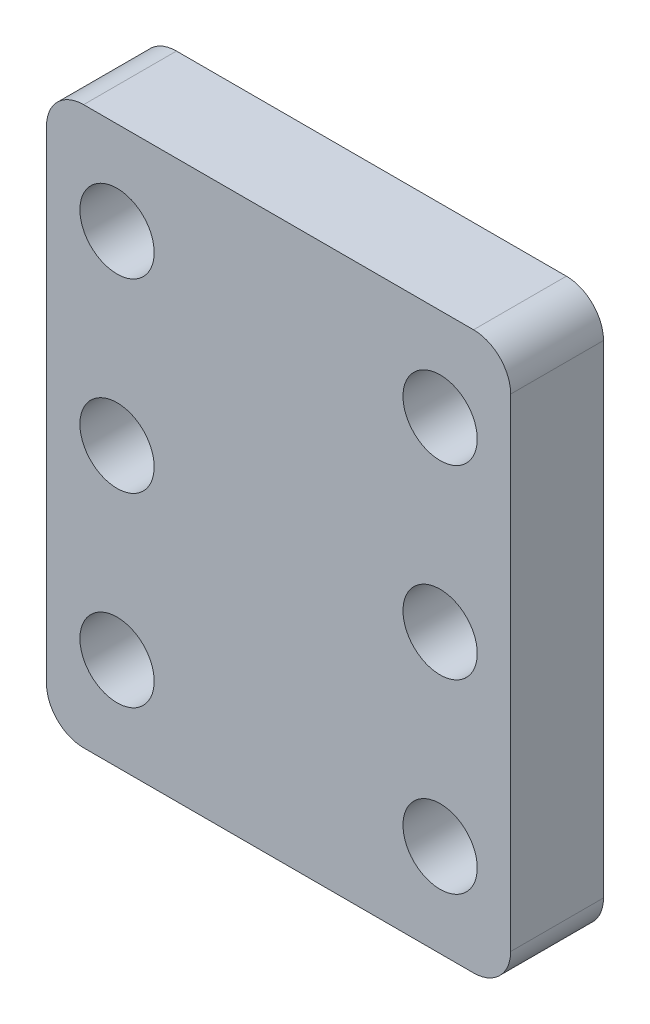
ISO-10303-21;
HEADER;
FILE_DESCRIPTION(('STEP AP214'),'2;1');
FILE_NAME('part.step','',(''),(''),'','','');
FILE_SCHEMA(('AUTOMOTIVE_DESIGN { 1 0 10303 214 1 1 1 1 }'));
ENDSEC;
DATA;
#1=APPLICATION_CONTEXT('core data for automotive mechanical design processes');
#2=APPLICATION_PROTOCOL_DEFINITION('international standard','automotive_design',2000,#1);
#3=PRODUCT_CONTEXT('',#1,'mechanical');
#4=PRODUCT('Part','Part','',(#3));
#5=PRODUCT_RELATED_PRODUCT_CATEGORY('part','',(#4));
#6=PRODUCT_DEFINITION_FORMATION('','',#4);
#7=PRODUCT_DEFINITION_CONTEXT('part definition',#1,'design');
#8=PRODUCT_DEFINITION('design','',#6,#7);
#9=PRODUCT_DEFINITION_SHAPE('','',#8);
#10=(LENGTH_UNIT() NAMED_UNIT(*) SI_UNIT(.MILLI.,.METRE.));
#11=(NAMED_UNIT(*) PLANE_ANGLE_UNIT() SI_UNIT($,.RADIAN.));
#12=(NAMED_UNIT(*) SI_UNIT($,.STERADIAN.) SOLID_ANGLE_UNIT());
#13=UNCERTAINTY_MEASURE_WITH_UNIT(LENGTH_MEASURE(1.E-05),#10,'distance_accuracy_value','');
#14=(GEOMETRIC_REPRESENTATION_CONTEXT(3) GLOBAL_UNCERTAINTY_ASSIGNED_CONTEXT((#13)) GLOBAL_UNIT_ASSIGNED_CONTEXT((#10,
#11,#12)) REPRESENTATION_CONTEXT('',''));
#15=CARTESIAN_POINT('',(0.,0.,0.));
#16=DIRECTION('',(0.,0.,1.));
#17=DIRECTION('',(1.,0.,0.));
#18=AXIS2_PLACEMENT_3D('',#15,#16,#17);
#19=CARTESIAN_POINT('',(-9.73666666666669,36.7241666666667,6.35));
#20=DIRECTION('',(0.,-1.,0.));
#21=DIRECTION('',(1.,0.,0.));
#22=AXIS2_PLACEMENT_3D('',#19,#20,#21);
#23=PLANE('',#22);
#24=DIRECTION('',(-1.,0.,0.));
#25=VECTOR('',#24,1.);
#26=CARTESIAN_POINT('',(-9.73666666666669,36.7241666666667,6.35));
#27=LINE('',#26,#25);
#28=CARTESIAN_POINT('',(-12.2766666666667,36.7241666666667,6.35));
#29=VERTEX_POINT('',#28);
#30=CARTESIAN_POINT('',(-38.9466666666667,36.7241666666667,6.35));
#31=VERTEX_POINT('',#30);
#32=EDGE_CURVE('E130',#29,#31,#27,.T.);
#33=ORIENTED_EDGE('',*,*,#32,.F.);
#34=DIRECTION('',(0.,0.,-1.));
#35=VECTOR('',#34,1.);
#36=CARTESIAN_POINT('',(-12.2766666666667,36.7241666666667,6.35));
#37=LINE('',#36,#35);
#38=CARTESIAN_POINT('',(-12.2766666666667,36.7241666666667,0.));
#39=VERTEX_POINT('',#38);
#40=EDGE_CURVE('E114',#29,#39,#37,.T.);
#41=ORIENTED_EDGE('',*,*,#40,.T.);
#42=DIRECTION('',(-1.,0.,0.));
#43=VECTOR('',#42,1.);
#44=CARTESIAN_POINT('',(-9.73666666666669,36.7241666666667,0.));
#45=LINE('',#44,#43);
#46=CARTESIAN_POINT('',(-38.9466666666667,36.7241666666667,0.));
#47=VERTEX_POINT('',#46);
#48=EDGE_CURVE('E127',#39,#47,#45,.T.);
#49=ORIENTED_EDGE('',*,*,#48,.T.);
#50=DIRECTION('',(0.,0.,-1.));
#51=VECTOR('',#50,1.);
#52=CARTESIAN_POINT('',(-38.9466666666667,36.7241666666667,6.35));
#53=LINE('',#52,#51);
#54=EDGE_CURVE('E133',#47,#31,#53,.F.);
#55=ORIENTED_EDGE('',*,*,#54,.T.);
#56=EDGE_LOOP('',(#33,#41,#49,#55));
#57=FACE_BOUND('',#56,.T.);
#58=ADVANCED_FACE('F43',(#57),#23,.F.);
#59=CARTESIAN_POINT('',(-41.4866666666667,36.7241666666667,6.35));
#60=DIRECTION('',(1.,0.,0.));
#61=DIRECTION('',(0.,0.,-1.));
#62=AXIS2_PLACEMENT_3D('',#59,#60,#61);
#63=PLANE('',#62);
#64=DIRECTION('',(0.,-1.,0.));
#65=VECTOR('',#64,1.);
#66=CARTESIAN_POINT('',(-41.4866666666667,36.7241666666667,0.));
#67=LINE('',#66,#65);
#68=CARTESIAN_POINT('',(-41.4866666666667,34.1841666666667,0.));
#69=VERTEX_POINT('',#68);
#70=CARTESIAN_POINT('',(-41.4866666666667,1.16416666666668,0.));
#71=VERTEX_POINT('',#70);
#72=EDGE_CURVE('E138',#69,#71,#67,.T.);
#73=ORIENTED_EDGE('',*,*,#72,.T.);
#74=DIRECTION('',(0.,0.,-1.));
#75=VECTOR('',#74,1.);
#76=CARTESIAN_POINT('',(-41.4866666666667,1.16416666666667,6.35));
#77=LINE('',#76,#75);
#78=CARTESIAN_POINT('',(-41.4866666666667,1.16416666666668,6.35));
#79=VERTEX_POINT('',#78);
#80=EDGE_CURVE('E11',#71,#79,#77,.F.);
#81=ORIENTED_EDGE('',*,*,#80,.T.);
#82=DIRECTION('',(0.,-1.,0.));
#83=VECTOR('',#82,1.);
#84=CARTESIAN_POINT('',(-41.4866666666667,36.7241666666667,6.35));
#85=LINE('',#84,#83);
#86=CARTESIAN_POINT('',(-41.4866666666667,34.1841666666667,6.35));
#87=VERTEX_POINT('',#86);
#88=EDGE_CURVE('E195',#87,#79,#85,.T.);
#89=ORIENTED_EDGE('',*,*,#88,.F.);
#90=DIRECTION('',(0.,0.,-1.));
#91=VECTOR('',#90,1.);
#92=CARTESIAN_POINT('',(-41.4866666666667,34.1841666666667,6.35));
#93=LINE('',#92,#91);
#94=EDGE_CURVE('E52',#87,#69,#93,.T.);
#95=ORIENTED_EDGE('',*,*,#94,.T.);
#96=EDGE_LOOP('',(#73,#81,#89,#95));
#97=FACE_BOUND('',#96,.T.);
#98=ADVANCED_FACE('F193',(#97),#63,.F.);
#99=CARTESIAN_POINT('',(-41.4866666666667,-1.37583333333333,6.35));
#100=DIRECTION('',(0.,1.,0.));
#101=DIRECTION('',(0.,0.,1.));
#102=AXIS2_PLACEMENT_3D('',#99,#100,#101);
#103=PLANE('',#102);
#104=DIRECTION('',(1.,0.,0.));
#105=VECTOR('',#104,1.);
#106=CARTESIAN_POINT('',(-41.4866666666667,-1.37583333333333,0.));
#107=LINE('',#106,#105);
#108=CARTESIAN_POINT('',(-38.9466666666667,-1.37583333333333,0.));
#109=VERTEX_POINT('',#108);
#110=CARTESIAN_POINT('',(-12.2766666666667,-1.37583333333333,0.));
#111=VERTEX_POINT('',#110);
#112=EDGE_CURVE('E144',#109,#111,#107,.T.);
#113=ORIENTED_EDGE('',*,*,#112,.T.);
#114=DIRECTION('',(0.,0.,-1.));
#115=VECTOR('',#114,1.);
#116=CARTESIAN_POINT('',(-12.2766666666667,-1.37583333333333,6.35));
#117=LINE('',#116,#115);
#118=CARTESIAN_POINT('',(-12.2766666666667,-1.37583333333333,6.35));
#119=VERTEX_POINT('',#118);
#120=EDGE_CURVE('E59',#111,#119,#117,.F.);
#121=ORIENTED_EDGE('',*,*,#120,.T.);
#122=DIRECTION('',(1.,0.,0.));
#123=VECTOR('',#122,1.);
#124=CARTESIAN_POINT('',(-41.4866666666667,-1.37583333333333,6.35));
#125=LINE('',#124,#123);
#126=CARTESIAN_POINT('',(-38.9466666666667,-1.37583333333333,6.35));
#127=VERTEX_POINT('',#126);
#128=EDGE_CURVE('E203',#127,#119,#125,.T.);
#129=ORIENTED_EDGE('',*,*,#128,.F.);
#130=DIRECTION('',(0.,0.,-1.));
#131=VECTOR('',#130,1.);
#132=CARTESIAN_POINT('',(-38.9466666666667,-1.37583333333333,6.35));
#133=LINE('',#132,#131);
#134=EDGE_CURVE('E183',#127,#109,#133,.T.);
#135=ORIENTED_EDGE('',*,*,#134,.T.);
#136=EDGE_LOOP('',(#113,#121,#129,#135));
#137=FACE_BOUND('',#136,.T.);
#138=ADVANCED_FACE('F202',(#137),#103,.F.);
#139=CARTESIAN_POINT('',(-9.73666666666669,-1.37583333333333,6.35));
#140=DIRECTION('',(-1.,0.,0.));
#141=DIRECTION('',(0.,0.,1.));
#142=AXIS2_PLACEMENT_3D('',#139,#140,#141);
#143=PLANE('',#142);
#144=DIRECTION('',(0.,1.,0.));
#145=VECTOR('',#144,1.);
#146=CARTESIAN_POINT('',(-9.73666666666669,-1.37583333333333,0.));
#147=LINE('',#146,#145);
#148=CARTESIAN_POINT('',(-9.73666666666669,1.16416666666667,0.));
#149=VERTEX_POINT('',#148);
#150=CARTESIAN_POINT('',(-9.73666666666669,34.1841666666667,0.));
#151=VERTEX_POINT('',#150);
#152=EDGE_CURVE('E155',#149,#151,#147,.T.);
#153=ORIENTED_EDGE('',*,*,#152,.T.);
#154=DIRECTION('',(0.,0.,-1.));
#155=VECTOR('',#154,1.);
#156=CARTESIAN_POINT('',(-9.73666666666669,34.1841666666667,6.35));
#157=LINE('',#156,#155);
#158=CARTESIAN_POINT('',(-9.73666666666669,34.1841666666667,6.35));
#159=VERTEX_POINT('',#158);
#160=EDGE_CURVE('E115',#151,#159,#157,.F.);
#161=ORIENTED_EDGE('',*,*,#160,.T.);
#162=DIRECTION('',(0.,1.,0.));
#163=VECTOR('',#162,1.);
#164=CARTESIAN_POINT('',(-9.73666666666669,-1.37583333333333,6.35));
#165=LINE('',#164,#163);
#166=CARTESIAN_POINT('',(-9.73666666666669,1.16416666666667,6.35));
#167=VERTEX_POINT('',#166);
#168=EDGE_CURVE('E150',#167,#159,#165,.T.);
#169=ORIENTED_EDGE('',*,*,#168,.F.);
#170=DIRECTION('',(0.,0.,-1.));
#171=VECTOR('',#170,1.);
#172=CARTESIAN_POINT('',(-9.73666666666669,1.16416666666667,6.35));
#173=LINE('',#172,#171);
#174=EDGE_CURVE('E121',#167,#149,#173,.T.);
#175=ORIENTED_EDGE('',*,*,#174,.T.);
#176=EDGE_LOOP('',(#153,#161,#169,#175));
#177=FACE_BOUND('',#176,.T.);
#178=ADVANCED_FACE('F262',(#177),#143,.F.);
#179=CARTESIAN_POINT('',(0.,0.,6.35));
#180=DIRECTION('',(0.,0.,1.));
#181=DIRECTION('',(1.,0.,0.));
#182=AXIS2_PLACEMENT_3D('',#179,#180,#181);
#183=PLANE('',#182);
#184=CARTESIAN_POINT('',(-36.6606666666667,30.3741666666667,6.35));
#185=DIRECTION('',(0.,0.,1.));
#186=DIRECTION('',(-1.,0.,0.));
#187=AXIS2_PLACEMENT_3D('',#184,#185,#186);
#188=CIRCLE('',#187,2.54);
#189=CARTESIAN_POINT('',(-39.2006666666667,30.3741666666667,6.35));
#190=VERTEX_POINT('',#189);
#191=EDGE_CURVE('E221',#190,#190,#188,.T.);
#192=ORIENTED_EDGE('',*,*,#191,.F.);
#193=EDGE_LOOP('',(#192));
#194=FACE_BOUND('',#193,.T.);
#195=CARTESIAN_POINT('',(-36.6606666666668,17.6741666666667,6.35));
#196=DIRECTION('',(0.,0.,1.));
#197=DIRECTION('',(-1.,0.,0.));
#198=AXIS2_PLACEMENT_3D('',#195,#196,#197);
#199=CIRCLE('',#198,2.54);
#200=CARTESIAN_POINT('',(-39.2006666666668,17.6741666666667,6.35));
#201=VERTEX_POINT('',#200);
#202=EDGE_CURVE('E229',#201,#201,#199,.T.);
#203=ORIENTED_EDGE('',*,*,#202,.F.);
#204=EDGE_LOOP('',(#203));
#205=FACE_BOUND('',#204,.T.);
#206=CARTESIAN_POINT('',(-36.660666666667,4.9741666666667,6.35));
#207=DIRECTION('',(0.,0.,1.));
#208=DIRECTION('',(-1.,0.,0.));
#209=AXIS2_PLACEMENT_3D('',#206,#207,#208);
#210=CIRCLE('',#209,2.53999999999999);
#211=CARTESIAN_POINT('',(-39.2006666666669,4.9741666666667,6.35));
#212=VERTEX_POINT('',#211);
#213=EDGE_CURVE('E237',#212,#212,#210,.T.);
#214=ORIENTED_EDGE('',*,*,#213,.F.);
#215=EDGE_LOOP('',(#214));
#216=FACE_BOUND('',#215,.T.);
#217=CARTESIAN_POINT('',(-14.5626666666664,4.97416666666668,6.35));
#218=DIRECTION('',(0.,0.,1.));
#219=DIRECTION('',(1.,0.,0.));
#220=AXIS2_PLACEMENT_3D('',#217,#218,#219);
#221=CIRCLE('',#220,2.54);
#222=CARTESIAN_POINT('',(-12.0226666666664,4.97416666666668,6.35));
#223=VERTEX_POINT('',#222);
#224=EDGE_CURVE('E245',#223,#223,#221,.T.);
#225=ORIENTED_EDGE('',*,*,#224,.F.);
#226=EDGE_LOOP('',(#225));
#227=FACE_BOUND('',#226,.T.);
#228=CARTESIAN_POINT('',(-14.5626666666666,17.6741666666667,6.35));
#229=DIRECTION('',(0.,0.,1.));
#230=DIRECTION('',(1.,0.,0.));
#231=AXIS2_PLACEMENT_3D('',#228,#229,#230);
#232=CIRCLE('',#231,2.54);
#233=CARTESIAN_POINT('',(-12.0226666666666,17.6741666666667,6.35));
#234=VERTEX_POINT('',#233);
#235=EDGE_CURVE('E215',#234,#234,#232,.T.);
#236=ORIENTED_EDGE('',*,*,#235,.F.);
#237=EDGE_LOOP('',(#236));
#238=FACE_BOUND('',#237,.T.);
#239=CARTESIAN_POINT('',(-14.5626666666667,30.3741666666667,6.35));
#240=DIRECTION('',(0.,0.,1.));
#241=DIRECTION('',(1.,0.,0.));
#242=AXIS2_PLACEMENT_3D('',#239,#240,#241);
#243=CIRCLE('',#242,2.54);
#244=CARTESIAN_POINT('',(-12.0226666666667,30.3741666666667,6.35));
#245=VERTEX_POINT('',#244);
#246=EDGE_CURVE('E147',#245,#245,#243,.T.);
#247=ORIENTED_EDGE('',*,*,#246,.F.);
#248=EDGE_LOOP('',(#247));
#249=FACE_BOUND('',#248,.T.);
#250=ORIENTED_EDGE('',*,*,#168,.T.);
#251=CARTESIAN_POINT('',(-12.2766666666667,34.1841666666667,6.35));
#252=DIRECTION('',(0.,0.,1.));
#253=DIRECTION('',(1.,0.,0.));
#254=AXIS2_PLACEMENT_3D('',#251,#252,#253);
#255=CIRCLE('',#254,2.54);
#256=EDGE_CURVE('E180',#159,#29,#255,.T.);
#257=ORIENTED_EDGE('',*,*,#256,.T.);
#258=ORIENTED_EDGE('',*,*,#32,.T.);
#259=CARTESIAN_POINT('',(-38.9466666666667,34.1841666666667,6.35));
#260=DIRECTION('',(0.,0.,1.));
#261=DIRECTION('',(1.,0.,0.));
#262=AXIS2_PLACEMENT_3D('',#259,#260,#261);
#263=CIRCLE('',#262,2.54);
#264=EDGE_CURVE('E172',#31,#87,#263,.T.);
#265=ORIENTED_EDGE('',*,*,#264,.T.);
#266=ORIENTED_EDGE('',*,*,#88,.T.);
#267=CARTESIAN_POINT('',(-38.9466666666667,1.16416666666667,6.35));
#268=DIRECTION('',(0.,0.,1.));
#269=DIRECTION('',(1.,0.,0.));
#270=AXIS2_PLACEMENT_3D('',#267,#268,#269);
#271=CIRCLE('',#270,2.54);
#272=EDGE_CURVE('E66',#79,#127,#271,.T.);
#273=ORIENTED_EDGE('',*,*,#272,.T.);
#274=ORIENTED_EDGE('',*,*,#128,.T.);
#275=CARTESIAN_POINT('',(-12.2766666666667,1.16416666666667,6.35));
#276=DIRECTION('',(0.,0.,1.));
#277=DIRECTION('',(1.,0.,0.));
#278=AXIS2_PLACEMENT_3D('',#275,#276,#277);
#279=CIRCLE('',#278,2.54);
#280=EDGE_CURVE('E177',#119,#167,#279,.T.);
#281=ORIENTED_EDGE('',*,*,#280,.T.);
#282=EDGE_LOOP('',(#250,#257,#258,#265,#266,#273,#274,#281));
#283=FACE_BOUND('',#282,.T.);
#284=ADVANCED_FACE('F259',(#194,#205,#216,#227,#238,#249,#283),#183,.T.);
#285=CARTESIAN_POINT('',(0.,0.,0.));
#286=DIRECTION('',(0.,0.,1.));
#287=DIRECTION('',(1.,0.,0.));
#288=AXIS2_PLACEMENT_3D('',#285,#286,#287);
#289=PLANE('',#288);
#290=CARTESIAN_POINT('',(-36.6606666666667,30.3741666666667,0.));
#291=DIRECTION('',(0.,0.,1.));
#292=DIRECTION('',(-1.,0.,0.));
#293=AXIS2_PLACEMENT_3D('',#290,#291,#292);
#294=CIRCLE('',#293,2.54);
#295=CARTESIAN_POINT('',(-39.2006666666667,30.3741666666667,0.));
#296=VERTEX_POINT('',#295);
#297=EDGE_CURVE('E217',#296,#296,#294,.T.);
#298=ORIENTED_EDGE('',*,*,#297,.T.);
#299=EDGE_LOOP('',(#298));
#300=FACE_BOUND('',#299,.T.);
#301=CARTESIAN_POINT('',(-36.6606666666668,17.6741666666667,0.));
#302=DIRECTION('',(0.,0.,1.));
#303=DIRECTION('',(-1.,0.,0.));
#304=AXIS2_PLACEMENT_3D('',#301,#302,#303);
#305=CIRCLE('',#304,2.54);
#306=CARTESIAN_POINT('',(-39.2006666666668,17.6741666666667,0.));
#307=VERTEX_POINT('',#306);
#308=EDGE_CURVE('E225',#307,#307,#305,.T.);
#309=ORIENTED_EDGE('',*,*,#308,.T.);
#310=EDGE_LOOP('',(#309));
#311=FACE_BOUND('',#310,.T.);
#312=CARTESIAN_POINT('',(-36.660666666667,4.9741666666667,0.));
#313=DIRECTION('',(0.,0.,1.));
#314=DIRECTION('',(-1.,0.,0.));
#315=AXIS2_PLACEMENT_3D('',#312,#313,#314);
#316=CIRCLE('',#315,2.53999999999999);
#317=CARTESIAN_POINT('',(-39.2006666666669,4.9741666666667,0.));
#318=VERTEX_POINT('',#317);
#319=EDGE_CURVE('E233',#318,#318,#316,.T.);
#320=ORIENTED_EDGE('',*,*,#319,.T.);
#321=EDGE_LOOP('',(#320));
#322=FACE_BOUND('',#321,.T.);
#323=CARTESIAN_POINT('',(-14.5626666666664,4.97416666666668,0.));
#324=DIRECTION('',(0.,0.,1.));
#325=DIRECTION('',(1.,0.,0.));
#326=AXIS2_PLACEMENT_3D('',#323,#324,#325);
#327=CIRCLE('',#326,2.54);
#328=CARTESIAN_POINT('',(-12.0226666666664,4.97416666666668,0.));
#329=VERTEX_POINT('',#328);
#330=EDGE_CURVE('E241',#329,#329,#327,.T.);
#331=ORIENTED_EDGE('',*,*,#330,.T.);
#332=EDGE_LOOP('',(#331));
#333=FACE_BOUND('',#332,.T.);
#334=CARTESIAN_POINT('',(-14.5626666666666,17.6741666666667,0.));
#335=DIRECTION('',(0.,0.,1.));
#336=DIRECTION('',(1.,0.,0.));
#337=AXIS2_PLACEMENT_3D('',#334,#335,#336);
#338=CIRCLE('',#337,2.54);
#339=CARTESIAN_POINT('',(-12.0226666666666,17.6741666666667,0.));
#340=VERTEX_POINT('',#339);
#341=EDGE_CURVE('E249',#340,#340,#338,.T.);
#342=ORIENTED_EDGE('',*,*,#341,.T.);
#343=EDGE_LOOP('',(#342));
#344=FACE_BOUND('',#343,.T.);
#345=CARTESIAN_POINT('',(-14.5626666666667,30.3741666666667,0.));
#346=DIRECTION('',(0.,0.,1.));
#347=DIRECTION('',(1.,0.,0.));
#348=AXIS2_PLACEMENT_3D('',#345,#346,#347);
#349=CIRCLE('',#348,2.54);
#350=CARTESIAN_POINT('',(-12.0226666666667,30.3741666666667,0.));
#351=VERTEX_POINT('',#350);
#352=EDGE_CURVE('E139',#351,#351,#349,.T.);
#353=ORIENTED_EDGE('',*,*,#352,.T.);
#354=EDGE_LOOP('',(#353));
#355=FACE_BOUND('',#354,.T.);
#356=ORIENTED_EDGE('',*,*,#48,.F.);
#357=CARTESIAN_POINT('',(-12.2766666666667,34.1841666666667,0.));
#358=DIRECTION('',(0.,0.,1.));
#359=DIRECTION('',(1.,0.,0.));
#360=AXIS2_PLACEMENT_3D('',#357,#358,#359);
#361=CIRCLE('',#360,2.54);
#362=EDGE_CURVE('E110',#39,#151,#361,.F.);
#363=ORIENTED_EDGE('',*,*,#362,.T.);
#364=ORIENTED_EDGE('',*,*,#152,.F.);
#365=CARTESIAN_POINT('',(-12.2766666666667,1.16416666666667,0.));
#366=DIRECTION('',(0.,0.,1.));
#367=DIRECTION('',(1.,0.,0.));
#368=AXIS2_PLACEMENT_3D('',#365,#366,#367);
#369=CIRCLE('',#368,2.54);
#370=EDGE_CURVE('E122',#149,#111,#369,.F.);
#371=ORIENTED_EDGE('',*,*,#370,.T.);
#372=ORIENTED_EDGE('',*,*,#112,.F.);
#373=CARTESIAN_POINT('',(-38.9466666666667,1.16416666666667,0.));
#374=DIRECTION('',(0.,0.,1.));
#375=DIRECTION('',(1.,0.,0.));
#376=AXIS2_PLACEMENT_3D('',#373,#374,#375);
#377=CIRCLE('',#376,2.54);
#378=EDGE_CURVE('E162',#109,#71,#377,.F.);
#379=ORIENTED_EDGE('',*,*,#378,.T.);
#380=ORIENTED_EDGE('',*,*,#72,.F.);
#381=CARTESIAN_POINT('',(-38.9466666666667,34.1841666666667,0.));
#382=DIRECTION('',(0.,0.,1.));
#383=DIRECTION('',(1.,0.,0.));
#384=AXIS2_PLACEMENT_3D('',#381,#382,#383);
#385=CIRCLE('',#384,2.54);
#386=EDGE_CURVE('E132',#69,#47,#385,.F.);
#387=ORIENTED_EDGE('',*,*,#386,.T.);
#388=EDGE_LOOP('',(#356,#363,#364,#371,#372,#379,#380,#387));
#389=FACE_BOUND('',#388,.T.);
#390=ADVANCED_FACE('F135',(#300,#311,#322,#333,#344,#355,#389),#289,.F.);
#391=CARTESIAN_POINT('',(-12.2766666666667,34.1841666666667,6.35));
#392=DIRECTION('',(0.,0.,-1.));
#393=DIRECTION('',(-1.,0.,0.));
#394=AXIS2_PLACEMENT_3D('',#391,#392,#393);
#395=CYLINDRICAL_SURFACE('',#394,2.54);
#396=ORIENTED_EDGE('',*,*,#256,.F.);
#397=ORIENTED_EDGE('',*,*,#160,.F.);
#398=ORIENTED_EDGE('',*,*,#362,.F.);
#399=ORIENTED_EDGE('',*,*,#40,.F.);
#400=EDGE_LOOP('',(#396,#397,#398,#399));
#401=FACE_BOUND('',#400,.T.);
#402=ADVANCED_FACE('F113',(#401),#395,.T.);
#403=CARTESIAN_POINT('',(-12.2766666666667,1.16416666666667,6.35));
#404=DIRECTION('',(0.,0.,-1.));
#405=DIRECTION('',(-1.,0.,0.));
#406=AXIS2_PLACEMENT_3D('',#403,#404,#405);
#407=CYLINDRICAL_SURFACE('',#406,2.54);
#408=ORIENTED_EDGE('',*,*,#280,.F.);
#409=ORIENTED_EDGE('',*,*,#120,.F.);
#410=ORIENTED_EDGE('',*,*,#370,.F.);
#411=ORIENTED_EDGE('',*,*,#174,.F.);
#412=EDGE_LOOP('',(#408,#409,#410,#411));
#413=FACE_BOUND('',#412,.T.);
#414=ADVANCED_FACE('F270',(#413),#407,.T.);
#415=CARTESIAN_POINT('',(-38.9466666666667,1.16416666666667,6.35));
#416=DIRECTION('',(0.,0.,-1.));
#417=DIRECTION('',(-1.,0.,0.));
#418=AXIS2_PLACEMENT_3D('',#415,#416,#417);
#419=CYLINDRICAL_SURFACE('',#418,2.54);
#420=ORIENTED_EDGE('',*,*,#272,.F.);
#421=ORIENTED_EDGE('',*,*,#80,.F.);
#422=ORIENTED_EDGE('',*,*,#378,.F.);
#423=ORIENTED_EDGE('',*,*,#134,.F.);
#424=EDGE_LOOP('',(#420,#421,#422,#423));
#425=FACE_BOUND('',#424,.T.);
#426=ADVANCED_FACE('F201',(#425),#419,.T.);
#427=CARTESIAN_POINT('',(-38.9466666666667,34.1841666666667,6.35));
#428=DIRECTION('',(0.,0.,-1.));
#429=DIRECTION('',(-1.,0.,0.));
#430=AXIS2_PLACEMENT_3D('',#427,#428,#429);
#431=CYLINDRICAL_SURFACE('',#430,2.54);
#432=ORIENTED_EDGE('',*,*,#264,.F.);
#433=ORIENTED_EDGE('',*,*,#54,.F.);
#434=ORIENTED_EDGE('',*,*,#386,.F.);
#435=ORIENTED_EDGE('',*,*,#94,.F.);
#436=EDGE_LOOP('',(#432,#433,#434,#435));
#437=FACE_BOUND('',#436,.T.);
#438=ADVANCED_FACE('F45',(#437),#431,.T.);
#439=CARTESIAN_POINT('',(-14.5626666666667,30.3741666666667,0.));
#440=DIRECTION('',(0.,0.,1.));
#441=DIRECTION('',(1.,0.,0.));
#442=AXIS2_PLACEMENT_3D('',#439,#440,#441);
#443=CYLINDRICAL_SURFACE('',#442,2.54);
#444=ORIENTED_EDGE('',*,*,#352,.F.);
#445=EDGE_LOOP('',(#444));
#446=FACE_BOUND('',#445,.T.);
#447=ORIENTED_EDGE('',*,*,#246,.T.);
#448=EDGE_LOOP('',(#447));
#449=FACE_BOUND('',#448,.T.);
#450=ADVANCED_FACE('F292',(#446,#449),#443,.F.);
#451=CARTESIAN_POINT('',(-14.5626666666666,17.6741666666667,0.));
#452=DIRECTION('',(0.,0.,1.));
#453=DIRECTION('',(1.,0.,0.));
#454=AXIS2_PLACEMENT_3D('',#451,#452,#453);
#455=CYLINDRICAL_SURFACE('',#454,2.54);
#456=ORIENTED_EDGE('',*,*,#341,.F.);
#457=EDGE_LOOP('',(#456));
#458=FACE_BOUND('',#457,.T.);
#459=ORIENTED_EDGE('',*,*,#235,.T.);
#460=EDGE_LOOP('',(#459));
#461=FACE_BOUND('',#460,.T.);
#462=ADVANCED_FACE('F257',(#458,#461),#455,.F.);
#463=CARTESIAN_POINT('',(-14.5626666666664,4.97416666666668,0.));
#464=DIRECTION('',(0.,0.,1.));
#465=DIRECTION('',(1.,0.,0.));
#466=AXIS2_PLACEMENT_3D('',#463,#464,#465);
#467=CYLINDRICAL_SURFACE('',#466,2.54);
#468=ORIENTED_EDGE('',*,*,#330,.F.);
#469=EDGE_LOOP('',(#468));
#470=FACE_BOUND('',#469,.T.);
#471=ORIENTED_EDGE('',*,*,#224,.T.);
#472=EDGE_LOOP('',(#471));
#473=FACE_BOUND('',#472,.T.);
#474=ADVANCED_FACE('F307',(#470,#473),#467,.F.);
#475=CARTESIAN_POINT('',(-36.660666666667,4.9741666666667,0.));
#476=DIRECTION('',(0.,0.,1.));
#477=DIRECTION('',(1.,0.,0.));
#478=AXIS2_PLACEMENT_3D('',#475,#476,#477);
#479=CYLINDRICAL_SURFACE('',#478,2.53999999999999);
#480=ORIENTED_EDGE('',*,*,#319,.F.);
#481=EDGE_LOOP('',(#480));
#482=FACE_BOUND('',#481,.T.);
#483=ORIENTED_EDGE('',*,*,#213,.T.);
#484=EDGE_LOOP('',(#483));
#485=FACE_BOUND('',#484,.T.);
#486=ADVANCED_FACE('F303',(#482,#485),#479,.F.);
#487=CARTESIAN_POINT('',(-36.6606666666668,17.6741666666667,0.));
#488=DIRECTION('',(0.,0.,1.));
#489=DIRECTION('',(1.,0.,0.));
#490=AXIS2_PLACEMENT_3D('',#487,#488,#489);
#491=CYLINDRICAL_SURFACE('',#490,2.54);
#492=ORIENTED_EDGE('',*,*,#308,.F.);
#493=EDGE_LOOP('',(#492));
#494=FACE_BOUND('',#493,.T.);
#495=ORIENTED_EDGE('',*,*,#202,.T.);
#496=EDGE_LOOP('',(#495));
#497=FACE_BOUND('',#496,.T.);
#498=ADVANCED_FACE('F299',(#494,#497),#491,.F.);
#499=CARTESIAN_POINT('',(-36.6606666666667,30.3741666666667,0.));
#500=DIRECTION('',(0.,0.,1.));
#501=DIRECTION('',(1.,0.,0.));
#502=AXIS2_PLACEMENT_3D('',#499,#500,#501);
#503=CYLINDRICAL_SURFACE('',#502,2.54);
#504=ORIENTED_EDGE('',*,*,#297,.F.);
#505=EDGE_LOOP('',(#504));
#506=FACE_BOUND('',#505,.T.);
#507=ORIENTED_EDGE('',*,*,#191,.T.);
#508=EDGE_LOOP('',(#507));
#509=FACE_BOUND('',#508,.T.);
#510=ADVANCED_FACE('F296',(#506,#509),#503,.F.);
#511=CLOSED_SHELL('',(#58,#98,#138,#178,#284,#390,#402,#414,#426,#438,#450,#462,#474,#486,#498,#510));
#512=MANIFOLD_SOLID_BREP('B2',#511);
#513=ADVANCED_BREP_SHAPE_REPRESENTATION('',(#18,#512),#14);
#514=SHAPE_DEFINITION_REPRESENTATION(#9,#513);
ENDSEC;
END-ISO-10303-21;
